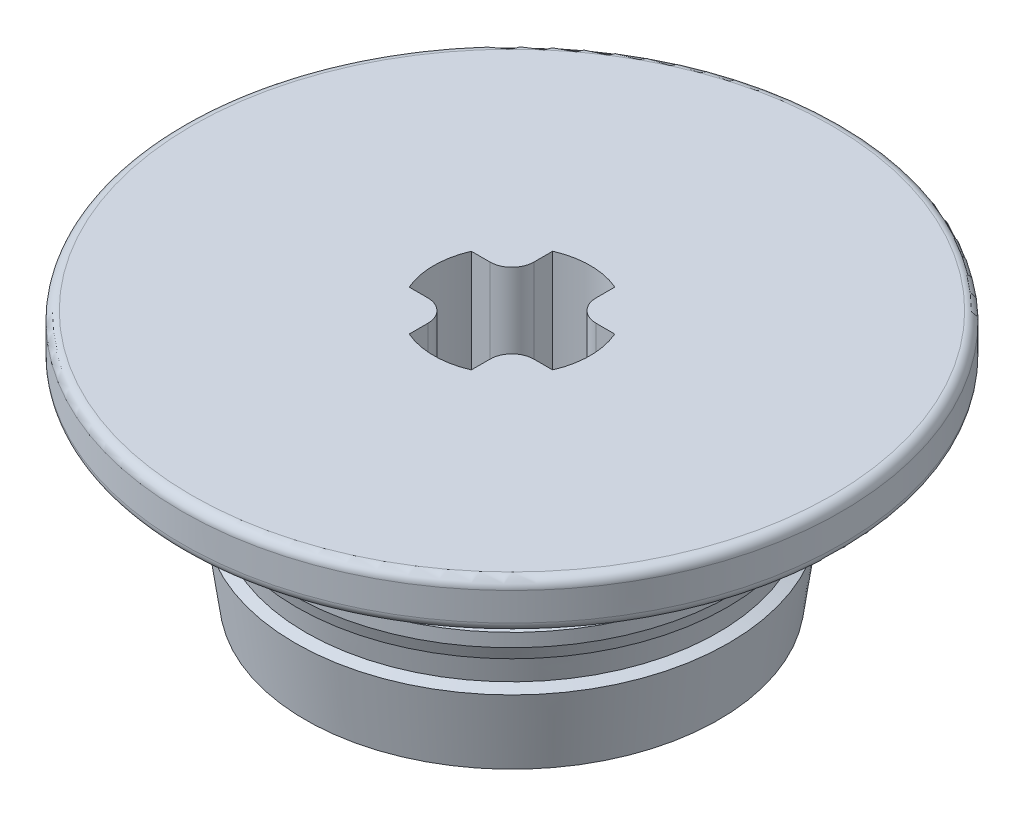
ISO-10303-21;
HEADER;
FILE_DESCRIPTION(('STEP AP214'),'2;1');
FILE_NAME('part.step','',(''),(''),'','','');
FILE_SCHEMA(('AUTOMOTIVE_DESIGN { 1 0 10303 214 1 1 1 1 }'));
ENDSEC;
DATA;
#1=APPLICATION_CONTEXT('core data for automotive mechanical design processes');
#2=APPLICATION_PROTOCOL_DEFINITION('international standard','automotive_design',2000,#1);
#3=PRODUCT_CONTEXT('',#1,'mechanical');
#4=PRODUCT('Part','Part','',(#3));
#5=PRODUCT_RELATED_PRODUCT_CATEGORY('part','',(#4));
#6=PRODUCT_DEFINITION_FORMATION('','',#4);
#7=PRODUCT_DEFINITION_CONTEXT('part definition',#1,'design');
#8=PRODUCT_DEFINITION('design','',#6,#7);
#9=PRODUCT_DEFINITION_SHAPE('','',#8);
#10=(LENGTH_UNIT() NAMED_UNIT(*) SI_UNIT(.MILLI.,.METRE.));
#11=(NAMED_UNIT(*) PLANE_ANGLE_UNIT() SI_UNIT($,.RADIAN.));
#12=(NAMED_UNIT(*) SI_UNIT($,.STERADIAN.) SOLID_ANGLE_UNIT());
#13=UNCERTAINTY_MEASURE_WITH_UNIT(LENGTH_MEASURE(1.E-05),#10,'distance_accuracy_value','');
#14=(GEOMETRIC_REPRESENTATION_CONTEXT(3) GLOBAL_UNCERTAINTY_ASSIGNED_CONTEXT((#13)) GLOBAL_UNIT_ASSIGNED_CONTEXT((#10,
#11,#12)) REPRESENTATION_CONTEXT('',''));
#15=CARTESIAN_POINT('',(0.,0.,0.));
#16=DIRECTION('',(0.,0.,1.));
#17=DIRECTION('',(1.,0.,0.));
#18=AXIS2_PLACEMENT_3D('',#15,#16,#17);
#19=CARTESIAN_POINT('',(0.,-1.83679026849459E-11,0.));
#20=DIRECTION('',(0.,1.,0.));
#21=DIRECTION('',(0.,0.,1.));
#22=AXIS2_PLACEMENT_3D('',#19,#20,#21);
#23=PLANE('',#22);
#24=CARTESIAN_POINT('',(0.,-1.83679026849459E-11,0.));
#25=DIRECTION('',(0.,1.,0.));
#26=DIRECTION('',(0.,0.,1.));
#27=AXIS2_PLACEMENT_3D('',#24,#25,#26);
#28=CIRCLE('',#27,10.2);
#29=CARTESIAN_POINT('',(0.,-1.83679026849459E-11,10.2));
#30=VERTEX_POINT('',#29);
#31=EDGE_CURVE('E315',#30,#30,#28,.T.);
#32=ORIENTED_EDGE('',*,*,#31,.T.);
#33=EDGE_LOOP('',(#32));
#34=FACE_BOUND('',#33,.T.);
#35=DIRECTION('',(0.,0.,1.));
#36=VECTOR('',#35,1.);
#37=CARTESIAN_POINT('',(-0.99,0.,0.990000000000009));
#38=LINE('',#37,#36);
#39=CARTESIAN_POINT('',(-0.99,0.,1.69000000000001));
#40=VERTEX_POINT('',#39);
#41=CARTESIAN_POINT('',(-0.99,0.,2.28473193175917));
#42=VERTEX_POINT('',#41);
#43=EDGE_CURVE('E211',#40,#42,#38,.T.);
#44=ORIENTED_EDGE('',*,*,#43,.F.);
#45=CARTESIAN_POINT('',(-1.69,-1.83672521636424E-11,1.69000000000001));
#46=DIRECTION('',(0.,1.,0.));
#47=DIRECTION('',(0.,0.,1.));
#48=AXIS2_PLACEMENT_3D('',#45,#46,#47);
#49=CIRCLE('',#48,0.7);
#50=CARTESIAN_POINT('',(-1.69,0.,0.990000000000009));
#51=VERTEX_POINT('',#50);
#52=EDGE_CURVE('E285',#40,#51,#49,.T.);
#53=ORIENTED_EDGE('',*,*,#52,.T.);
#54=DIRECTION('',(1.,0.,0.));
#55=VECTOR('',#54,1.);
#56=CARTESIAN_POINT('',(-2.28473193175917,0.,0.990000000000009));
#57=LINE('',#56,#55);
#58=CARTESIAN_POINT('',(-2.28473193175917,0.,0.99000000000001));
#59=VERTEX_POINT('',#58);
#60=EDGE_CURVE('E209',#59,#51,#57,.T.);
#61=ORIENTED_EDGE('',*,*,#60,.F.);
#62=CARTESIAN_POINT('',(0.,0.,0.));
#63=DIRECTION('',(0.,1.,0.));
#64=DIRECTION('',(0.,0.,1.));
#65=AXIS2_PLACEMENT_3D('',#62,#63,#64);
#66=CIRCLE('',#65,2.49);
#67=CARTESIAN_POINT('',(-2.28473193175917,0.,-0.99000000000001));
#68=VERTEX_POINT('',#67);
#69=EDGE_CURVE('E160',#68,#59,#66,.T.);
#70=ORIENTED_EDGE('',*,*,#69,.F.);
#71=DIRECTION('',(-1.,0.,0.));
#72=VECTOR('',#71,1.);
#73=CARTESIAN_POINT('',(-0.99,0.,-0.99000000000001));
#74=LINE('',#73,#72);
#75=CARTESIAN_POINT('',(-1.69,0.,-0.99000000000001));
#76=VERTEX_POINT('',#75);
#77=EDGE_CURVE('E206',#76,#68,#74,.T.);
#78=ORIENTED_EDGE('',*,*,#77,.F.);
#79=CARTESIAN_POINT('',(-1.69,-1.83672521636424E-11,-1.69000000000001));
#80=DIRECTION('',(0.,1.,0.));
#81=DIRECTION('',(0.,0.,1.));
#82=AXIS2_PLACEMENT_3D('',#79,#80,#81);
#83=CIRCLE('',#82,0.7);
#84=CARTESIAN_POINT('',(-0.99,0.,-1.69000000000001));
#85=VERTEX_POINT('',#84);
#86=EDGE_CURVE('E279',#76,#85,#83,.T.);
#87=ORIENTED_EDGE('',*,*,#86,.T.);
#88=DIRECTION('',(0.,0.,1.));
#89=VECTOR('',#88,1.);
#90=CARTESIAN_POINT('',(-0.99,0.,-2.28753254026193));
#91=LINE('',#90,#89);
#92=CARTESIAN_POINT('',(-0.99,0.,-2.28753254026193));
#93=VERTEX_POINT('',#92);
#94=EDGE_CURVE('E203',#93,#85,#91,.T.);
#95=ORIENTED_EDGE('',*,*,#94,.F.);
#96=CARTESIAN_POINT('',(0.,0.,0.));
#97=DIRECTION('',(0.,1.,0.));
#98=DIRECTION('',(0.,0.,-1.));
#99=AXIS2_PLACEMENT_3D('',#96,#97,#98);
#100=CIRCLE('',#99,2.49256998352247);
#101=CARTESIAN_POINT('',(0.99,0.,-2.28753254026193));
#102=VERTEX_POINT('',#101);
#103=EDGE_CURVE('E228',#102,#93,#100,.T.);
#104=ORIENTED_EDGE('',*,*,#103,.F.);
#105=DIRECTION('',(0.,0.,-1.));
#106=VECTOR('',#105,1.);
#107=CARTESIAN_POINT('',(0.99,0.,-2.28753254026193));
#108=LINE('',#107,#106);
#109=CARTESIAN_POINT('',(0.99,0.,-1.69));
#110=VERTEX_POINT('',#109);
#111=EDGE_CURVE('E226',#110,#102,#108,.T.);
#112=ORIENTED_EDGE('',*,*,#111,.F.);
#113=CARTESIAN_POINT('',(1.69,-1.83672521636424E-11,-1.69));
#114=DIRECTION('',(0.,1.,0.));
#115=DIRECTION('',(0.,0.,1.));
#116=AXIS2_PLACEMENT_3D('',#113,#114,#115);
#117=CIRCLE('',#116,0.7);
#118=CARTESIAN_POINT('',(1.69,0.,-0.990000000000003));
#119=VERTEX_POINT('',#118);
#120=EDGE_CURVE('E281',#110,#119,#117,.T.);
#121=ORIENTED_EDGE('',*,*,#120,.T.);
#122=DIRECTION('',(-1.,0.,0.));
#123=VECTOR('',#122,1.);
#124=CARTESIAN_POINT('',(0.99,0.,-0.990000000000003));
#125=LINE('',#124,#123);
#126=CARTESIAN_POINT('',(2.28424982597489,0.,-0.990000000000003));
#127=VERTEX_POINT('',#126);
#128=EDGE_CURVE('E224',#127,#119,#125,.T.);
#129=ORIENTED_EDGE('',*,*,#128,.F.);
#130=CARTESIAN_POINT('',(0.,0.,0.));
#131=DIRECTION('',(0.,1.,0.));
#132=DIRECTION('',(0.,0.,-1.));
#133=AXIS2_PLACEMENT_3D('',#130,#131,#132);
#134=CIRCLE('',#133,2.48955764493742);
#135=CARTESIAN_POINT('',(2.28424982597489,0.,0.990000000000003));
#136=VERTEX_POINT('',#135);
#137=EDGE_CURVE('E221',#136,#127,#134,.T.);
#138=ORIENTED_EDGE('',*,*,#137,.F.);
#139=DIRECTION('',(1.,0.,0.));
#140=VECTOR('',#139,1.);
#141=CARTESIAN_POINT('',(0.99,0.,0.990000000000003));
#142=LINE('',#141,#140);
#143=CARTESIAN_POINT('',(1.69,0.,0.990000000000003));
#144=VERTEX_POINT('',#143);
#145=EDGE_CURVE('E219',#144,#136,#142,.T.);
#146=ORIENTED_EDGE('',*,*,#145,.F.);
#147=CARTESIAN_POINT('',(1.69,-1.83672521636424E-11,1.69));
#148=DIRECTION('',(0.,1.,0.));
#149=DIRECTION('',(0.,0.,1.));
#150=AXIS2_PLACEMENT_3D('',#147,#148,#149);
#151=CIRCLE('',#150,0.7);
#152=CARTESIAN_POINT('',(0.99,0.,1.69));
#153=VERTEX_POINT('',#152);
#154=EDGE_CURVE('E283',#144,#153,#151,.T.);
#155=ORIENTED_EDGE('',*,*,#154,.T.);
#156=DIRECTION('',(0.,0.,-1.));
#157=VECTOR('',#156,1.);
#158=CARTESIAN_POINT('',(0.99,0.,2.28473193175917));
#159=LINE('',#158,#157);
#160=CARTESIAN_POINT('',(0.99,0.,2.28473193175917));
#161=VERTEX_POINT('',#160);
#162=EDGE_CURVE('E216',#161,#153,#159,.T.);
#163=ORIENTED_EDGE('',*,*,#162,.F.);
#164=CARTESIAN_POINT('',(0.,0.,0.));
#165=DIRECTION('',(0.,1.,0.));
#166=DIRECTION('',(0.,0.,1.));
#167=AXIS2_PLACEMENT_3D('',#164,#165,#166);
#168=CIRCLE('',#167,2.49);
#169=EDGE_CURVE('E213',#42,#161,#168,.T.);
#170=ORIENTED_EDGE('',*,*,#169,.F.);
#171=EDGE_LOOP('',(#44,#53,#61,#70,#78,#87,#95,#104,#112,#121,#129,#138,#146,#155,#163,#170));
#172=FACE_BOUND('',#171,.T.);
#173=ADVANCED_FACE('F37',(#34,#172),#23,.T.);
#174=CARTESIAN_POINT('',(0.,0.,0.));
#175=DIRECTION('',(0.,-1.,0.));
#176=DIRECTION('',(0.,0.,-1.));
#177=AXIS2_PLACEMENT_3D('',#174,#175,#176);
#178=CYLINDRICAL_SURFACE('',#177,10.5);
#179=CARTESIAN_POINT('',(0.,-0.300000000018368,0.));
#180=DIRECTION('',(0.,1.,0.));
#181=DIRECTION('',(0.,0.,1.));
#182=AXIS2_PLACEMENT_3D('',#179,#180,#181);
#183=CIRCLE('',#182,10.5);
#184=CARTESIAN_POINT('',(0.,-0.300000000018368,10.5));
#185=VERTEX_POINT('',#184);
#186=EDGE_CURVE('E312',#185,#185,#183,.F.);
#187=ORIENTED_EDGE('',*,*,#186,.T.);
#188=EDGE_LOOP('',(#187));
#189=FACE_BOUND('',#188,.T.);
#190=CARTESIAN_POINT('',(0.,-1.2,0.));
#191=DIRECTION('',(0.,-1.,0.));
#192=DIRECTION('',(0.,0.,-1.));
#193=AXIS2_PLACEMENT_3D('',#190,#191,#192);
#194=CIRCLE('',#193,10.5);
#195=CARTESIAN_POINT('',(0.,-1.2,-10.5));
#196=VERTEX_POINT('',#195);
#197=EDGE_CURVE('E309',#196,#196,#194,.F.);
#198=ORIENTED_EDGE('',*,*,#197,.T.);
#199=EDGE_LOOP('',(#198));
#200=FACE_BOUND('',#199,.T.);
#201=ADVANCED_FACE('F335',(#189,#200),#178,.T.);
#202=CARTESIAN_POINT('',(10.5,-1.5,0.));
#203=DIRECTION('',(0.,-1.,0.));
#204=DIRECTION('',(0.,0.,-1.));
#205=AXIS2_PLACEMENT_3D('',#202,#203,#204);
#206=PLANE('',#205);
#207=CARTESIAN_POINT('',(0.,-1.5,0.));
#208=DIRECTION('',(0.,-1.,0.));
#209=DIRECTION('',(0.,0.,-1.));
#210=AXIS2_PLACEMENT_3D('',#207,#208,#209);
#211=CIRCLE('',#210,7.76078602134487);
#212=CARTESIAN_POINT('',(0.,-1.5,-7.76078602134487));
#213=VERTEX_POINT('',#212);
#214=EDGE_CURVE('E11',#213,#213,#211,.F.);
#215=ORIENTED_EDGE('',*,*,#214,.T.);
#216=EDGE_LOOP('',(#215));
#217=FACE_BOUND('',#216,.T.);
#218=CARTESIAN_POINT('',(0.,-1.5,0.));
#219=DIRECTION('',(0.,-1.,0.));
#220=DIRECTION('',(0.,0.,-1.));
#221=AXIS2_PLACEMENT_3D('',#218,#219,#220);
#222=CIRCLE('',#221,10.2);
#223=CARTESIAN_POINT('',(0.,-1.5,-10.2));
#224=VERTEX_POINT('',#223);
#225=EDGE_CURVE('E45',#224,#224,#222,.T.);
#226=ORIENTED_EDGE('',*,*,#225,.T.);
#227=EDGE_LOOP('',(#226));
#228=FACE_BOUND('',#227,.T.);
#229=ADVANCED_FACE('F323',(#217,#228),#206,.T.);
#230=CARTESIAN_POINT('',(0.,-2.98540210311236,0.));
#231=DIRECTION('',(0.,1.,0.));
#232=DIRECTION('',(0.,0.,1.));
#233=AXIS2_PLACEMENT_3D('',#230,#231,#232);
#234=CONICAL_SURFACE('',#233,7.2912403485599,0.139626340159546);
#235=CARTESIAN_POINT('',(0.,-1.75824806971198,0.));
#236=DIRECTION('',(0.,1.,0.));
#237=DIRECTION('',(0.,0.,1.));
#238=AXIS2_PLACEMENT_3D('',#235,#236,#237);
#239=CIRCLE('',#238,7.4637056007224);
#240=CARTESIAN_POINT('',(0.,-1.75824806971198,7.4637056007224));
#241=VERTEX_POINT('',#240);
#242=EDGE_CURVE('E318',#241,#241,#239,.F.);
#243=ORIENTED_EDGE('',*,*,#242,.T.);
#244=EDGE_LOOP('',(#243));
#245=FACE_BOUND('',#244,.T.);
#246=CARTESIAN_POINT('',(0.,-2.98540210311236,0.));
#247=DIRECTION('',(0.,-1.,0.));
#248=DIRECTION('',(0.,0.,-1.));
#249=AXIS2_PLACEMENT_3D('',#246,#247,#248);
#250=CIRCLE('',#249,7.2912403485599);
#251=CARTESIAN_POINT('',(0.,-2.98540210311236,-7.2912403485599));
#252=VERTEX_POINT('',#251);
#253=EDGE_CURVE('E273',#252,#252,#250,.T.);
#254=ORIENTED_EDGE('',*,*,#253,.F.);
#255=EDGE_LOOP('',(#254));
#256=FACE_BOUND('',#255,.T.);
#257=ADVANCED_FACE('F625',(#245,#256),#234,.T.);
#258=CARTESIAN_POINT('',(0.,-2.93641121464983,0.));
#259=DIRECTION('',(0.,-1.,0.));
#260=DIRECTION('',(0.,0.,-1.));
#261=AXIS2_PLACEMENT_3D('',#258,#259,#260);
#262=CONICAL_SURFACE('',#261,6.94265206412097,1.43116998663535);
#263=ORIENTED_EDGE('',*,*,#253,.T.);
#264=EDGE_LOOP('',(#263));
#265=FACE_BOUND('',#264,.T.);
#266=CARTESIAN_POINT('',(0.,-2.93641121464983,0.));
#267=DIRECTION('',(0.,-1.,0.));
#268=DIRECTION('',(0.,0.,-1.));
#269=AXIS2_PLACEMENT_3D('',#266,#267,#268);
#270=CIRCLE('',#269,6.94265206412097);
#271=CARTESIAN_POINT('',(0.,-2.93641121464983,-6.94265206412097));
#272=VERTEX_POINT('',#271);
#273=EDGE_CURVE('E270',#272,#272,#270,.T.);
#274=ORIENTED_EDGE('',*,*,#273,.F.);
#275=EDGE_LOOP('',(#274));
#276=FACE_BOUND('',#275,.T.);
#277=ADVANCED_FACE('F615',(#265,#276),#262,.F.);
#278=CARTESIAN_POINT('',(0.,-3.9266792833914,0.));
#279=DIRECTION('',(0.,1.,0.));
#280=DIRECTION('',(0.,0.,1.));
#281=AXIS2_PLACEMENT_3D('',#278,#279,#280);
#282=CONICAL_SURFACE('',#281,6.80347896316091,0.139626340159549);
#283=ORIENTED_EDGE('',*,*,#273,.T.);
#284=EDGE_LOOP('',(#283));
#285=FACE_BOUND('',#284,.T.);
#286=CARTESIAN_POINT('',(0.,-3.9266792833914,0.));
#287=DIRECTION('',(0.,-1.,0.));
#288=DIRECTION('',(0.,0.,-1.));
#289=AXIS2_PLACEMENT_3D('',#286,#287,#288);
#290=CIRCLE('',#289,6.80347896316091);
#291=CARTESIAN_POINT('',(0.,-3.9266792833914,-6.80347896316091));
#292=VERTEX_POINT('',#291);
#293=EDGE_CURVE('E267',#292,#292,#290,.T.);
#294=ORIENTED_EDGE('',*,*,#293,.F.);
#295=EDGE_LOOP('',(#294));
#296=FACE_BOUND('',#295,.T.);
#297=ADVANCED_FACE('F605',(#285,#296),#282,.T.);
#298=CARTESIAN_POINT('',(0.,-3.95039339052812,0.));
#299=DIRECTION('',(0.,-1.,0.));
#300=DIRECTION('',(0.,0.,-1.));
#301=AXIS2_PLACEMENT_3D('',#298,#299,#300);
#302=CONICAL_SURFACE('',#301,6.97221360307485,1.43116998663535);
#303=ORIENTED_EDGE('',*,*,#293,.T.);
#304=EDGE_LOOP('',(#303));
#305=FACE_BOUND('',#304,.T.);
#306=CARTESIAN_POINT('',(0.,-3.95039339052812,0.));
#307=DIRECTION('',(0.,-1.,0.));
#308=DIRECTION('',(0.,0.,-1.));
#309=AXIS2_PLACEMENT_3D('',#306,#307,#308);
#310=CIRCLE('',#309,6.97221360307485);
#311=CARTESIAN_POINT('',(0.,-3.95039339052812,-6.97221360307485));
#312=VERTEX_POINT('',#311);
#313=EDGE_CURVE('E264',#312,#312,#310,.T.);
#314=ORIENTED_EDGE('',*,*,#313,.F.);
#315=EDGE_LOOP('',(#314));
#316=FACE_BOUND('',#315,.T.);
#317=ADVANCED_FACE('F595',(#305,#316),#302,.T.);
#318=CARTESIAN_POINT('',(0.,0.,0.));
#319=DIRECTION('',(0.,-1.,0.));
#320=DIRECTION('',(0.,0.,-1.));
#321=AXIS2_PLACEMENT_3D('',#318,#319,#320);
#322=CYLINDRICAL_SURFACE('',#321,6.97221360307485);
#323=ORIENTED_EDGE('',*,*,#313,.T.);
#324=EDGE_LOOP('',(#323));
#325=FACE_BOUND('',#324,.T.);
#326=CARTESIAN_POINT('',(0.,-4.3742970253929,0.));
#327=DIRECTION('',(0.,-1.,0.));
#328=DIRECTION('',(0.,0.,-1.));
#329=AXIS2_PLACEMENT_3D('',#326,#327,#328);
#330=CIRCLE('',#329,6.97221360307485);
#331=CARTESIAN_POINT('',(0.,-4.3742970253929,-6.97221360307485));
#332=VERTEX_POINT('',#331);
#333=EDGE_CURVE('E261',#332,#332,#330,.T.);
#334=ORIENTED_EDGE('',*,*,#333,.F.);
#335=EDGE_LOOP('',(#334));
#336=FACE_BOUND('',#335,.T.);
#337=ADVANCED_FACE('F585',(#325,#336),#322,.T.);
#338=CARTESIAN_POINT('',(0.,-4.75677403953127,0.));
#339=DIRECTION('',(0.,1.,0.));
#340=DIRECTION('',(0.,0.,1.));
#341=AXIS2_PLACEMENT_3D('',#338,#339,#340);
#342=CONICAL_SURFACE('',#341,6.8619465090299,0.280686104589303);
#343=ORIENTED_EDGE('',*,*,#333,.T.);
#344=EDGE_LOOP('',(#343));
#345=FACE_BOUND('',#344,.T.);
#346=CARTESIAN_POINT('',(0.,-4.75677403953127,0.));
#347=DIRECTION('',(0.,-1.,0.));
#348=DIRECTION('',(0.,0.,-1.));
#349=AXIS2_PLACEMENT_3D('',#346,#347,#348);
#350=CIRCLE('',#349,6.8619465090299);
#351=CARTESIAN_POINT('',(0.,-4.75677403953127,-6.8619465090299));
#352=VERTEX_POINT('',#351);
#353=EDGE_CURVE('E258',#352,#352,#350,.T.);
#354=ORIENTED_EDGE('',*,*,#353,.F.);
#355=EDGE_LOOP('',(#354));
#356=FACE_BOUND('',#355,.T.);
#357=ADVANCED_FACE('F575',(#345,#356),#342,.T.);
#358=CARTESIAN_POINT('',(0.,-4.73263788812737,0.));
#359=DIRECTION('',(0.,-1.,0.));
#360=DIRECTION('',(0.,0.,-1.));
#361=AXIS2_PLACEMENT_3D('',#358,#359,#360);
#362=CONICAL_SURFACE('',#361,6.69020886811574,1.43116998663535);
#363=ORIENTED_EDGE('',*,*,#353,.T.);
#364=EDGE_LOOP('',(#363));
#365=FACE_BOUND('',#364,.T.);
#366=CARTESIAN_POINT('',(0.,-4.73263788812737,0.));
#367=DIRECTION('',(0.,-1.,0.));
#368=DIRECTION('',(0.,0.,-1.));
#369=AXIS2_PLACEMENT_3D('',#366,#367,#368);
#370=CIRCLE('',#369,6.69020886811574);
#371=CARTESIAN_POINT('',(0.,-4.73263788812737,-6.69020886811574));
#372=VERTEX_POINT('',#371);
#373=EDGE_CURVE('E255',#372,#372,#370,.T.);
#374=ORIENTED_EDGE('',*,*,#373,.F.);
#375=EDGE_LOOP('',(#374));
#376=FACE_BOUND('',#375,.T.);
#377=ADVANCED_FACE('F565',(#365,#376),#362,.F.);
#378=CARTESIAN_POINT('',(0.,-5.60014185836126,0.));
#379=DIRECTION('',(0.,1.,0.));
#380=DIRECTION('',(0.,0.,1.));
#381=AXIS2_PLACEMENT_3D('',#378,#379,#380);
#382=CONICAL_SURFACE('',#381,6.56828913603143,0.139626340159547);
#383=ORIENTED_EDGE('',*,*,#373,.T.);
#384=EDGE_LOOP('',(#383));
#385=FACE_BOUND('',#384,.T.);
#386=CARTESIAN_POINT('',(0.,-5.60014185836126,0.));
#387=DIRECTION('',(0.,-1.,0.));
#388=DIRECTION('',(0.,0.,-1.));
#389=AXIS2_PLACEMENT_3D('',#386,#387,#388);
#390=CIRCLE('',#389,6.56828913603143);
#391=CARTESIAN_POINT('',(0.,-5.60014185836126,-6.56828913603143));
#392=VERTEX_POINT('',#391);
#393=EDGE_CURVE('E252',#392,#392,#390,.T.);
#394=ORIENTED_EDGE('',*,*,#393,.F.);
#395=EDGE_LOOP('',(#394));
#396=FACE_BOUND('',#395,.T.);
#397=ADVANCED_FACE('F555',(#385,#396),#382,.T.);
#398=CARTESIAN_POINT('',(0.,-5.72275097697547,0.));
#399=DIRECTION('',(0.,-1.,0.));
#400=DIRECTION('',(0.,0.,-1.));
#401=AXIS2_PLACEMENT_3D('',#398,#399,#400);
#402=CONICAL_SURFACE('',#401,6.90653105295553,1.223038684079);
#403=ORIENTED_EDGE('',*,*,#393,.T.);
#404=EDGE_LOOP('',(#403));
#405=FACE_BOUND('',#404,.T.);
#406=CARTESIAN_POINT('',(0.,-5.72275097697547,0.));
#407=DIRECTION('',(0.,-1.,0.));
#408=DIRECTION('',(0.,0.,-1.));
#409=AXIS2_PLACEMENT_3D('',#406,#407,#408);
#410=CIRCLE('',#409,6.90653105295553);
#411=CARTESIAN_POINT('',(0.,-5.72275097697547,-6.90653105295553));
#412=VERTEX_POINT('',#411);
#413=EDGE_CURVE('E249',#412,#412,#410,.T.);
#414=ORIENTED_EDGE('',*,*,#413,.F.);
#415=EDGE_LOOP('',(#414));
#416=FACE_BOUND('',#415,.T.);
#417=ADVANCED_FACE('F545',(#405,#416),#402,.T.);
#418=CARTESIAN_POINT('',(0.,-8.,0.));
#419=DIRECTION('',(0.,1.,0.));
#420=DIRECTION('',(0.,0.,1.));
#421=AXIS2_PLACEMENT_3D('',#418,#419,#420);
#422=CONICAL_SURFACE('',#421,6.58648457443446,0.139626340159547);
#423=ORIENTED_EDGE('',*,*,#413,.T.);
#424=EDGE_LOOP('',(#423));
#425=FACE_BOUND('',#424,.T.);
#426=CARTESIAN_POINT('',(0.,-8.,0.));
#427=DIRECTION('',(0.,-1.,0.));
#428=DIRECTION('',(0.,0.,-1.));
#429=AXIS2_PLACEMENT_3D('',#426,#427,#428);
#430=CIRCLE('',#429,6.58648457443446);
#431=CARTESIAN_POINT('',(0.,-8.,-6.58648457443446));
#432=VERTEX_POINT('',#431);
#433=EDGE_CURVE('E233',#432,#432,#430,.T.);
#434=ORIENTED_EDGE('',*,*,#433,.F.);
#435=EDGE_LOOP('',(#434));
#436=FACE_BOUND('',#435,.T.);
#437=ADVANCED_FACE('F536',(#425,#436),#422,.T.);
#438=CARTESIAN_POINT('',(6.58648457443446,-8.,0.));
#439=DIRECTION('',(0.,-1.,0.));
#440=DIRECTION('',(0.,0.,-1.));
#441=AXIS2_PLACEMENT_3D('',#438,#439,#440);
#442=PLANE('',#441);
#443=DIRECTION('',(1.,0.,0.));
#444=VECTOR('',#443,1.);
#445=CARTESIAN_POINT('',(-2.28473193175917,-8.,0.990000000000009));
#446=LINE('',#445,#444);
#447=CARTESIAN_POINT('',(-2.28473193175917,-8.,0.99000000000001));
#448=VERTEX_POINT('',#447);
#449=CARTESIAN_POINT('',(-1.69,-8.,0.990000000000009));
#450=VERTEX_POINT('',#449);
#451=EDGE_CURVE('E168',#448,#450,#446,.T.);
#452=ORIENTED_EDGE('',*,*,#451,.T.);
#453=CARTESIAN_POINT('',(-1.69,-8.,1.69000000000001));
#454=DIRECTION('',(0.,-1.,0.));
#455=DIRECTION('',(0.,0.,-1.));
#456=AXIS2_PLACEMENT_3D('',#453,#454,#455);
#457=CIRCLE('',#456,0.7);
#458=CARTESIAN_POINT('',(-0.99,-8.,1.69000000000001));
#459=VERTEX_POINT('',#458);
#460=EDGE_CURVE('E293',#450,#459,#457,.T.);
#461=ORIENTED_EDGE('',*,*,#460,.T.);
#462=DIRECTION('',(0.,0.,1.));
#463=VECTOR('',#462,1.);
#464=CARTESIAN_POINT('',(-0.99,-8.,0.990000000000009));
#465=LINE('',#464,#463);
#466=CARTESIAN_POINT('',(-0.99,-8.,2.28473193175917));
#467=VERTEX_POINT('',#466);
#468=EDGE_CURVE('E173',#459,#467,#465,.T.);
#469=ORIENTED_EDGE('',*,*,#468,.T.);
#470=CARTESIAN_POINT('',(0.,-8.,0.));
#471=DIRECTION('',(0.,1.,0.));
#472=DIRECTION('',(0.,0.,1.));
#473=AXIS2_PLACEMENT_3D('',#470,#471,#472);
#474=CIRCLE('',#473,2.49);
#475=CARTESIAN_POINT('',(0.99,-8.,2.28473193175917));
#476=VERTEX_POINT('',#475);
#477=EDGE_CURVE('E185',#467,#476,#474,.T.);
#478=ORIENTED_EDGE('',*,*,#477,.T.);
#479=DIRECTION('',(0.,0.,-1.));
#480=VECTOR('',#479,1.);
#481=CARTESIAN_POINT('',(0.99,-8.,2.28473193175917));
#482=LINE('',#481,#480);
#483=CARTESIAN_POINT('',(0.99,-8.,1.69));
#484=VERTEX_POINT('',#483);
#485=EDGE_CURVE('E188',#476,#484,#482,.T.);
#486=ORIENTED_EDGE('',*,*,#485,.T.);
#487=CARTESIAN_POINT('',(1.69,-8.,1.69));
#488=DIRECTION('',(0.,-1.,0.));
#489=DIRECTION('',(0.,0.,-1.));
#490=AXIS2_PLACEMENT_3D('',#487,#488,#489);
#491=CIRCLE('',#490,0.7);
#492=CARTESIAN_POINT('',(1.69,-8.,0.990000000000003));
#493=VERTEX_POINT('',#492);
#494=EDGE_CURVE('E291',#484,#493,#491,.T.);
#495=ORIENTED_EDGE('',*,*,#494,.T.);
#496=DIRECTION('',(1.,0.,0.));
#497=VECTOR('',#496,1.);
#498=CARTESIAN_POINT('',(0.99,-8.,0.990000000000003));
#499=LINE('',#498,#497);
#500=CARTESIAN_POINT('',(2.28424982597489,-8.,0.990000000000003));
#501=VERTEX_POINT('',#500);
#502=EDGE_CURVE('E191',#493,#501,#499,.T.);
#503=ORIENTED_EDGE('',*,*,#502,.T.);
#504=CARTESIAN_POINT('',(0.,-8.,0.));
#505=DIRECTION('',(0.,1.,0.));
#506=DIRECTION('',(0.,0.,-1.));
#507=AXIS2_PLACEMENT_3D('',#504,#505,#506);
#508=CIRCLE('',#507,2.48955764493742);
#509=CARTESIAN_POINT('',(2.28424982597489,-8.,-0.990000000000003));
#510=VERTEX_POINT('',#509);
#511=EDGE_CURVE('E193',#501,#510,#508,.T.);
#512=ORIENTED_EDGE('',*,*,#511,.T.);
#513=DIRECTION('',(-1.,0.,0.));
#514=VECTOR('',#513,1.);
#515=CARTESIAN_POINT('',(0.99,-8.,-0.990000000000003));
#516=LINE('',#515,#514);
#517=CARTESIAN_POINT('',(1.69,-8.,-0.990000000000003));
#518=VERTEX_POINT('',#517);
#519=EDGE_CURVE('E196',#510,#518,#516,.T.);
#520=ORIENTED_EDGE('',*,*,#519,.T.);
#521=CARTESIAN_POINT('',(1.69,-8.,-1.69));
#522=DIRECTION('',(0.,-1.,0.));
#523=DIRECTION('',(0.,0.,-1.));
#524=AXIS2_PLACEMENT_3D('',#521,#522,#523);
#525=CIRCLE('',#524,0.7);
#526=CARTESIAN_POINT('',(0.99,-8.,-1.69));
#527=VERTEX_POINT('',#526);
#528=EDGE_CURVE('E52',#518,#527,#525,.T.);
#529=ORIENTED_EDGE('',*,*,#528,.T.);
#530=DIRECTION('',(0.,0.,-1.));
#531=VECTOR('',#530,1.);
#532=CARTESIAN_POINT('',(0.99,-8.,-2.28753254026193));
#533=LINE('',#532,#531);
#534=CARTESIAN_POINT('',(0.99,-8.,-2.28753254026193));
#535=VERTEX_POINT('',#534);
#536=EDGE_CURVE('E198',#527,#535,#533,.T.);
#537=ORIENTED_EDGE('',*,*,#536,.T.);
#538=CARTESIAN_POINT('',(0.,-8.,0.));
#539=DIRECTION('',(0.,1.,0.));
#540=DIRECTION('',(0.,0.,-1.));
#541=AXIS2_PLACEMENT_3D('',#538,#539,#540);
#542=CIRCLE('',#541,2.49256998352247);
#543=CARTESIAN_POINT('',(-0.99,-8.,-2.28753254026193));
#544=VERTEX_POINT('',#543);
#545=EDGE_CURVE('E200',#535,#544,#542,.T.);
#546=ORIENTED_EDGE('',*,*,#545,.T.);
#547=DIRECTION('',(0.,0.,1.));
#548=VECTOR('',#547,1.);
#549=CARTESIAN_POINT('',(-0.99,-8.,-2.28753254026193));
#550=LINE('',#549,#548);
#551=CARTESIAN_POINT('',(-0.99,-8.,-1.69000000000001));
#552=VERTEX_POINT('',#551);
#553=EDGE_CURVE('E180',#544,#552,#550,.T.);
#554=ORIENTED_EDGE('',*,*,#553,.T.);
#555=CARTESIAN_POINT('',(-1.69,-8.,-1.69000000000001));
#556=DIRECTION('',(0.,-1.,0.));
#557=DIRECTION('',(0.,0.,-1.));
#558=AXIS2_PLACEMENT_3D('',#555,#556,#557);
#559=CIRCLE('',#558,0.7);
#560=CARTESIAN_POINT('',(-1.69,-8.,-0.99000000000001));
#561=VERTEX_POINT('',#560);
#562=EDGE_CURVE('E288',#552,#561,#559,.T.);
#563=ORIENTED_EDGE('',*,*,#562,.T.);
#564=DIRECTION('',(-1.,0.,0.));
#565=VECTOR('',#564,1.);
#566=CARTESIAN_POINT('',(-0.99,-8.,-0.99000000000001));
#567=LINE('',#566,#565);
#568=CARTESIAN_POINT('',(-2.28473193175917,-8.,-0.99000000000001));
#569=VERTEX_POINT('',#568);
#570=EDGE_CURVE('E178',#561,#569,#567,.T.);
#571=ORIENTED_EDGE('',*,*,#570,.T.);
#572=CARTESIAN_POINT('',(0.,-8.,0.));
#573=DIRECTION('',(0.,1.,0.));
#574=DIRECTION('',(0.,0.,1.));
#575=AXIS2_PLACEMENT_3D('',#572,#573,#574);
#576=CIRCLE('',#575,2.49);
#577=EDGE_CURVE('E157',#569,#448,#576,.T.);
#578=ORIENTED_EDGE('',*,*,#577,.T.);
#579=EDGE_LOOP('',(#452,#461,#469,#478,#486,#495,#503,#512,#520,#529,#537,#546,#554,#563,#571,#578));
#580=FACE_BOUND('',#579,.T.);
#581=ORIENTED_EDGE('',*,*,#433,.T.);
#582=EDGE_LOOP('',(#581));
#583=FACE_BOUND('',#582,.T.);
#584=ADVANCED_FACE('F175',(#580,#583),#442,.T.);
#585=CARTESIAN_POINT('',(-0.99,-8.,-2.28753254026193));
#586=DIRECTION('',(-1.,0.,0.));
#587=DIRECTION('',(0.,0.,1.));
#588=AXIS2_PLACEMENT_3D('',#585,#586,#587);
#589=PLANE('',#588);
#590=ORIENTED_EDGE('',*,*,#94,.T.);
#591=DIRECTION('',(0.,1.,0.));
#592=VECTOR('',#591,1.);
#593=CARTESIAN_POINT('',(-0.99,-8.,-1.69000000000001));
#594=LINE('',#593,#592);
#595=EDGE_CURVE('E307',#85,#552,#594,.F.);
#596=ORIENTED_EDGE('',*,*,#595,.T.);
#597=ORIENTED_EDGE('',*,*,#553,.F.);
#598=DIRECTION('',(0.,1.,0.));
#599=VECTOR('',#598,1.);
#600=CARTESIAN_POINT('',(-0.99,-8.,-2.28753254026193));
#601=LINE('',#600,#599);
#602=EDGE_CURVE('E231',#544,#93,#601,.T.);
#603=ORIENTED_EDGE('',*,*,#602,.T.);
#604=EDGE_LOOP('',(#590,#596,#597,#603));
#605=FACE_BOUND('',#604,.T.);
#606=ADVANCED_FACE('F517',(#605),#589,.F.);
#607=CARTESIAN_POINT('',(0.,-8.,0.));
#608=DIRECTION('',(0.,1.,0.));
#609=DIRECTION('',(0.,0.,1.));
#610=AXIS2_PLACEMENT_3D('',#607,#608,#609);
#611=CYLINDRICAL_SURFACE('',#610,2.49256998352247);
#612=ORIENTED_EDGE('',*,*,#103,.T.);
#613=ORIENTED_EDGE('',*,*,#602,.F.);
#614=ORIENTED_EDGE('',*,*,#545,.F.);
#615=DIRECTION('',(0.,1.,0.));
#616=VECTOR('',#615,1.);
#617=CARTESIAN_POINT('',(0.99,-8.,-2.28753254026193));
#618=LINE('',#617,#616);
#619=EDGE_CURVE('E234',#535,#102,#618,.T.);
#620=ORIENTED_EDGE('',*,*,#619,.T.);
#621=EDGE_LOOP('',(#612,#613,#614,#620));
#622=FACE_BOUND('',#621,.T.);
#623=ADVANCED_FACE('F507',(#622),#611,.F.);
#624=CARTESIAN_POINT('',(0.99,-8.,-2.28753254026193));
#625=DIRECTION('',(1.,0.,0.));
#626=DIRECTION('',(0.,0.,-1.));
#627=AXIS2_PLACEMENT_3D('',#624,#625,#626);
#628=PLANE('',#627);
#629=ORIENTED_EDGE('',*,*,#536,.F.);
#630=DIRECTION('',(0.,1.,0.));
#631=VECTOR('',#630,1.);
#632=CARTESIAN_POINT('',(0.99,-8.,-1.69));
#633=LINE('',#632,#631);
#634=EDGE_CURVE('E300',#527,#110,#633,.T.);
#635=ORIENTED_EDGE('',*,*,#634,.T.);
#636=ORIENTED_EDGE('',*,*,#111,.T.);
#637=ORIENTED_EDGE('',*,*,#619,.F.);
#638=EDGE_LOOP('',(#629,#635,#636,#637));
#639=FACE_BOUND('',#638,.T.);
#640=ADVANCED_FACE('F498',(#639),#628,.F.);
#641=CARTESIAN_POINT('',(0.99,-8.,-0.990000000000003));
#642=DIRECTION('',(0.,0.,-1.));
#643=DIRECTION('',(-1.,0.,0.));
#644=AXIS2_PLACEMENT_3D('',#641,#642,#643);
#645=PLANE('',#644);
#646=ORIENTED_EDGE('',*,*,#128,.T.);
#647=DIRECTION('',(0.,1.,0.));
#648=VECTOR('',#647,1.);
#649=CARTESIAN_POINT('',(1.69,-8.,-0.990000000000003));
#650=LINE('',#649,#648);
#651=EDGE_CURVE('E60',#119,#518,#650,.F.);
#652=ORIENTED_EDGE('',*,*,#651,.T.);
#653=ORIENTED_EDGE('',*,*,#519,.F.);
#654=DIRECTION('',(0.,1.,0.));
#655=VECTOR('',#654,1.);
#656=CARTESIAN_POINT('',(2.28424982597489,-8.,-0.990000000000003));
#657=LINE('',#656,#655);
#658=EDGE_CURVE('E237',#510,#127,#657,.T.);
#659=ORIENTED_EDGE('',*,*,#658,.T.);
#660=EDGE_LOOP('',(#646,#652,#653,#659));
#661=FACE_BOUND('',#660,.T.);
#662=ADVANCED_FACE('F488',(#661),#645,.F.);
#663=CARTESIAN_POINT('',(0.,-8.,0.));
#664=DIRECTION('',(0.,1.,0.));
#665=DIRECTION('',(0.,0.,1.));
#666=AXIS2_PLACEMENT_3D('',#663,#664,#665);
#667=CYLINDRICAL_SURFACE('',#666,2.48955764493742);
#668=ORIENTED_EDGE('',*,*,#137,.T.);
#669=ORIENTED_EDGE('',*,*,#658,.F.);
#670=ORIENTED_EDGE('',*,*,#511,.F.);
#671=DIRECTION('',(0.,1.,0.));
#672=VECTOR('',#671,1.);
#673=CARTESIAN_POINT('',(2.28424982597489,-8.,0.990000000000003));
#674=LINE('',#673,#672);
#675=EDGE_CURVE('E239',#501,#136,#674,.T.);
#676=ORIENTED_EDGE('',*,*,#675,.T.);
#677=EDGE_LOOP('',(#668,#669,#670,#676));
#678=FACE_BOUND('',#677,.T.);
#679=ADVANCED_FACE('F478',(#678),#667,.F.);
#680=CARTESIAN_POINT('',(0.99,-8.,0.990000000000003));
#681=DIRECTION('',(0.,0.,1.));
#682=DIRECTION('',(1.,0.,0.));
#683=AXIS2_PLACEMENT_3D('',#680,#681,#682);
#684=PLANE('',#683);
#685=ORIENTED_EDGE('',*,*,#502,.F.);
#686=DIRECTION('',(0.,1.,0.));
#687=VECTOR('',#686,1.);
#688=CARTESIAN_POINT('',(1.69,-8.,0.990000000000003));
#689=LINE('',#688,#687);
#690=EDGE_CURVE('E295',#493,#144,#689,.T.);
#691=ORIENTED_EDGE('',*,*,#690,.T.);
#692=ORIENTED_EDGE('',*,*,#145,.T.);
#693=ORIENTED_EDGE('',*,*,#675,.F.);
#694=EDGE_LOOP('',(#685,#691,#692,#693));
#695=FACE_BOUND('',#694,.T.);
#696=ADVANCED_FACE('F468',(#695),#684,.F.);
#697=CARTESIAN_POINT('',(0.99,-8.,2.28473193175917));
#698=DIRECTION('',(1.,0.,0.));
#699=DIRECTION('',(0.,0.,-1.));
#700=AXIS2_PLACEMENT_3D('',#697,#698,#699);
#701=PLANE('',#700);
#702=ORIENTED_EDGE('',*,*,#162,.T.);
#703=DIRECTION('',(0.,1.,0.));
#704=VECTOR('',#703,1.);
#705=CARTESIAN_POINT('',(0.99,-8.,1.69));
#706=LINE('',#705,#704);
#707=EDGE_CURVE('E298',#153,#484,#706,.F.);
#708=ORIENTED_EDGE('',*,*,#707,.T.);
#709=ORIENTED_EDGE('',*,*,#485,.F.);
#710=DIRECTION('',(0.,1.,0.));
#711=VECTOR('',#710,1.);
#712=CARTESIAN_POINT('',(0.99,-8.,2.28473193175917));
#713=LINE('',#712,#711);
#714=EDGE_CURVE('E242',#476,#161,#713,.T.);
#715=ORIENTED_EDGE('',*,*,#714,.T.);
#716=EDGE_LOOP('',(#702,#708,#709,#715));
#717=FACE_BOUND('',#716,.T.);
#718=ADVANCED_FACE('F458',(#717),#701,.F.);
#719=CARTESIAN_POINT('',(0.,-8.,0.));
#720=DIRECTION('',(0.,1.,0.));
#721=DIRECTION('',(0.,0.,1.));
#722=AXIS2_PLACEMENT_3D('',#719,#720,#721);
#723=CYLINDRICAL_SURFACE('',#722,2.49);
#724=ORIENTED_EDGE('',*,*,#169,.T.);
#725=ORIENTED_EDGE('',*,*,#714,.F.);
#726=ORIENTED_EDGE('',*,*,#477,.F.);
#727=DIRECTION('',(0.,1.,0.));
#728=VECTOR('',#727,1.);
#729=CARTESIAN_POINT('',(-0.99,-8.,2.28473193175917));
#730=LINE('',#729,#728);
#731=EDGE_CURVE('E164',#467,#42,#730,.T.);
#732=ORIENTED_EDGE('',*,*,#731,.T.);
#733=EDGE_LOOP('',(#724,#725,#726,#732));
#734=FACE_BOUND('',#733,.T.);
#735=ADVANCED_FACE('F448',(#734),#723,.F.);
#736=CARTESIAN_POINT('',(-0.99,-8.,0.990000000000009));
#737=DIRECTION('',(-1.,0.,0.));
#738=DIRECTION('',(0.,0.,1.));
#739=AXIS2_PLACEMENT_3D('',#736,#737,#738);
#740=PLANE('',#739);
#741=ORIENTED_EDGE('',*,*,#468,.F.);
#742=DIRECTION('',(0.,1.,0.));
#743=VECTOR('',#742,1.);
#744=CARTESIAN_POINT('',(-0.99,-8.,1.69000000000001));
#745=LINE('',#744,#743);
#746=EDGE_CURVE('E276',#459,#40,#745,.T.);
#747=ORIENTED_EDGE('',*,*,#746,.T.);
#748=ORIENTED_EDGE('',*,*,#43,.T.);
#749=ORIENTED_EDGE('',*,*,#731,.F.);
#750=EDGE_LOOP('',(#741,#747,#748,#749));
#751=FACE_BOUND('',#750,.T.);
#752=ADVANCED_FACE('F439',(#751),#740,.F.);
#753=CARTESIAN_POINT('',(-2.28473193175917,-8.,0.990000000000009));
#754=DIRECTION('',(0.,0.,1.));
#755=DIRECTION('',(1.,0.,0.));
#756=AXIS2_PLACEMENT_3D('',#753,#754,#755);
#757=PLANE('',#756);
#758=ORIENTED_EDGE('',*,*,#60,.T.);
#759=DIRECTION('',(0.,1.,0.));
#760=VECTOR('',#759,1.);
#761=CARTESIAN_POINT('',(-1.69,-8.,0.990000000000009));
#762=LINE('',#761,#760);
#763=EDGE_CURVE('E171',#51,#450,#762,.F.);
#764=ORIENTED_EDGE('',*,*,#763,.T.);
#765=ORIENTED_EDGE('',*,*,#451,.F.);
#766=DIRECTION('',(0.,1.,0.));
#767=VECTOR('',#766,1.);
#768=CARTESIAN_POINT('',(-2.28473193175917,-8.,0.99000000000001));
#769=LINE('',#768,#767);
#770=EDGE_CURVE('E152',#448,#59,#769,.T.);
#771=ORIENTED_EDGE('',*,*,#770,.T.);
#772=EDGE_LOOP('',(#758,#764,#765,#771));
#773=FACE_BOUND('',#772,.T.);
#774=ADVANCED_FACE('F169',(#773),#757,.F.);
#775=CARTESIAN_POINT('',(0.,-8.,0.));
#776=DIRECTION('',(0.,1.,0.));
#777=DIRECTION('',(0.,0.,1.));
#778=AXIS2_PLACEMENT_3D('',#775,#776,#777);
#779=CYLINDRICAL_SURFACE('',#778,2.49);
#780=ORIENTED_EDGE('',*,*,#69,.T.);
#781=ORIENTED_EDGE('',*,*,#770,.F.);
#782=ORIENTED_EDGE('',*,*,#577,.F.);
#783=DIRECTION('',(0.,1.,0.));
#784=VECTOR('',#783,1.);
#785=CARTESIAN_POINT('',(-2.28473193175917,-8.,-0.99000000000001));
#786=LINE('',#785,#784);
#787=EDGE_CURVE('E165',#569,#68,#786,.T.);
#788=ORIENTED_EDGE('',*,*,#787,.T.);
#789=EDGE_LOOP('',(#780,#781,#782,#788));
#790=FACE_BOUND('',#789,.T.);
#791=ADVANCED_FACE('F154',(#790),#779,.F.);
#792=CARTESIAN_POINT('',(-0.99,-8.,-0.99000000000001));
#793=DIRECTION('',(0.,0.,-1.));
#794=DIRECTION('',(-1.,0.,0.));
#795=AXIS2_PLACEMENT_3D('',#792,#793,#794);
#796=PLANE('',#795);
#797=ORIENTED_EDGE('',*,*,#570,.F.);
#798=DIRECTION('',(0.,1.,0.));
#799=VECTOR('',#798,1.);
#800=CARTESIAN_POINT('',(-1.69,-8.,-0.99000000000001));
#801=LINE('',#800,#799);
#802=EDGE_CURVE('E304',#561,#76,#801,.T.);
#803=ORIENTED_EDGE('',*,*,#802,.T.);
#804=ORIENTED_EDGE('',*,*,#77,.T.);
#805=ORIENTED_EDGE('',*,*,#787,.F.);
#806=EDGE_LOOP('',(#797,#803,#804,#805));
#807=FACE_BOUND('',#806,.T.);
#808=ADVANCED_FACE('F350',(#807),#796,.F.);
#809=CARTESIAN_POINT('',(-1.69,-8.,1.69000000000001));
#810=DIRECTION('',(0.,1.,0.));
#811=DIRECTION('',(0.,0.,1.));
#812=AXIS2_PLACEMENT_3D('',#809,#810,#811);
#813=CYLINDRICAL_SURFACE('',#812,0.7);
#814=ORIENTED_EDGE('',*,*,#460,.F.);
#815=ORIENTED_EDGE('',*,*,#763,.F.);
#816=ORIENTED_EDGE('',*,*,#52,.F.);
#817=ORIENTED_EDGE('',*,*,#746,.F.);
#818=EDGE_LOOP('',(#814,#815,#816,#817));
#819=FACE_BOUND('',#818,.T.);
#820=ADVANCED_FACE('F346',(#819),#813,.T.);
#821=CARTESIAN_POINT('',(1.69,-8.,1.69));
#822=DIRECTION('',(0.,1.,0.));
#823=DIRECTION('',(0.,0.,1.));
#824=AXIS2_PLACEMENT_3D('',#821,#822,#823);
#825=CYLINDRICAL_SURFACE('',#824,0.7);
#826=ORIENTED_EDGE('',*,*,#494,.F.);
#827=ORIENTED_EDGE('',*,*,#707,.F.);
#828=ORIENTED_EDGE('',*,*,#154,.F.);
#829=ORIENTED_EDGE('',*,*,#690,.F.);
#830=EDGE_LOOP('',(#826,#827,#828,#829));
#831=FACE_BOUND('',#830,.T.);
#832=ADVANCED_FACE('F349',(#831),#825,.T.);
#833=CARTESIAN_POINT('',(1.69,-8.,-1.69));
#834=DIRECTION('',(0.,1.,0.));
#835=DIRECTION('',(0.,0.,1.));
#836=AXIS2_PLACEMENT_3D('',#833,#834,#835);
#837=CYLINDRICAL_SURFACE('',#836,0.7);
#838=ORIENTED_EDGE('',*,*,#528,.F.);
#839=ORIENTED_EDGE('',*,*,#651,.F.);
#840=ORIENTED_EDGE('',*,*,#120,.F.);
#841=ORIENTED_EDGE('',*,*,#634,.F.);
#842=EDGE_LOOP('',(#838,#839,#840,#841));
#843=FACE_BOUND('',#842,.T.);
#844=ADVANCED_FACE('F354',(#843),#837,.T.);
#845=CARTESIAN_POINT('',(-1.69,-8.,-1.69000000000001));
#846=DIRECTION('',(0.,1.,0.));
#847=DIRECTION('',(0.,0.,1.));
#848=AXIS2_PLACEMENT_3D('',#845,#846,#847);
#849=CYLINDRICAL_SURFACE('',#848,0.7);
#850=ORIENTED_EDGE('',*,*,#562,.F.);
#851=ORIENTED_EDGE('',*,*,#595,.F.);
#852=ORIENTED_EDGE('',*,*,#86,.F.);
#853=ORIENTED_EDGE('',*,*,#802,.F.);
#854=EDGE_LOOP('',(#850,#851,#852,#853));
#855=FACE_BOUND('',#854,.T.);
#856=ADVANCED_FACE('F358',(#855),#849,.T.);
#857=CARTESIAN_POINT('',(0.,-0.300000000018368,0.));
#858=DIRECTION('',(0.,1.,0.));
#859=DIRECTION('',(0.,0.,1.));
#860=AXIS2_PLACEMENT_3D('',#857,#858,#859);
#861=TOROIDAL_SURFACE('',#860,10.2,0.3);
#862=ORIENTED_EDGE('',*,*,#31,.F.);
#863=EDGE_LOOP('',(#862));
#864=FACE_BOUND('',#863,.T.);
#865=ORIENTED_EDGE('',*,*,#186,.F.);
#866=EDGE_LOOP('',(#865));
#867=FACE_BOUND('',#866,.T.);
#868=ADVANCED_FACE('F331',(#864,#867),#861,.T.);
#869=CARTESIAN_POINT('',(0.,-1.8,0.));
#870=DIRECTION('',(0.,-1.,0.));
#871=DIRECTION('',(0.,0.,-1.));
#872=AXIS2_PLACEMENT_3D('',#869,#870,#871);
#873=TOROIDAL_SURFACE('',#872,7.76078602134487,0.3);
#874=ORIENTED_EDGE('',*,*,#214,.F.);
#875=EDGE_LOOP('',(#874));
#876=FACE_BOUND('',#875,.T.);
#877=ORIENTED_EDGE('',*,*,#242,.F.);
#878=EDGE_LOOP('',(#877));
#879=FACE_BOUND('',#878,.T.);
#880=ADVANCED_FACE('F326',(#876,#879),#873,.F.);
#881=CARTESIAN_POINT('',(0.,-1.2,0.));
#882=DIRECTION('',(0.,-1.,0.));
#883=DIRECTION('',(0.,0.,-1.));
#884=AXIS2_PLACEMENT_3D('',#881,#882,#883);
#885=TOROIDAL_SURFACE('',#884,10.2,0.3);
#886=ORIENTED_EDGE('',*,*,#197,.F.);
#887=EDGE_LOOP('',(#886));
#888=FACE_BOUND('',#887,.T.);
#889=ORIENTED_EDGE('',*,*,#225,.F.);
#890=EDGE_LOOP('',(#889));
#891=FACE_BOUND('',#890,.T.);
#892=ADVANCED_FACE('F39',(#888,#891),#885,.T.);
#893=CLOSED_SHELL('',(#173,#201,#229,#257,#277,#297,#317,#337,#357,#377,#397,#417,#437,#584,
#606,#623,#640,#662,#679,#696,#718,#735,#752,#774,#791,#808,#820,#832,#844,#856,#868,#880,#892));
#894=MANIFOLD_SOLID_BREP('B2',#893);
#895=ADVANCED_BREP_SHAPE_REPRESENTATION('',(#18,#894),#14);
#896=SHAPE_DEFINITION_REPRESENTATION(#9,#895);
ENDSEC;
END-ISO-10303-21;
